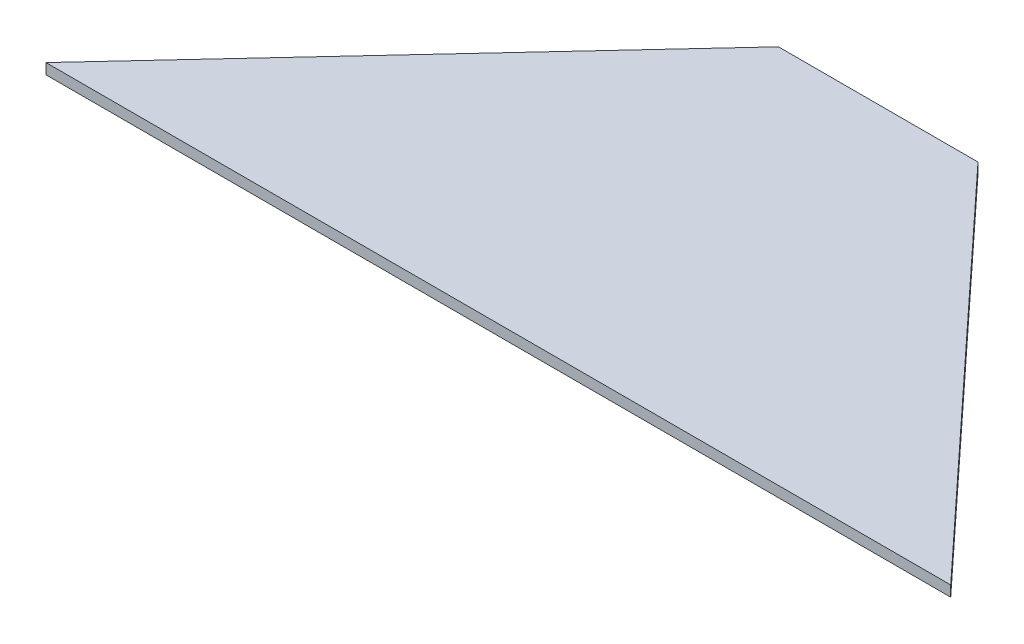
ISO-10303-21;
HEADER;
FILE_DESCRIPTION(('STEP AP214'),'2;1');
FILE_NAME('part.step','',(''),(''),'','','');
FILE_SCHEMA(('AUTOMOTIVE_DESIGN { 1 0 10303 214 1 1 1 1 }'));
ENDSEC;
DATA;
#1=APPLICATION_CONTEXT('core data for automotive mechanical design processes');
#2=APPLICATION_PROTOCOL_DEFINITION('international standard','automotive_design',2000,#1);
#3=PRODUCT_CONTEXT('',#1,'mechanical');
#4=PRODUCT('Part','Part','',(#3));
#5=PRODUCT_RELATED_PRODUCT_CATEGORY('part','',(#4));
#6=PRODUCT_DEFINITION_FORMATION('','',#4);
#7=PRODUCT_DEFINITION_CONTEXT('part definition',#1,'design');
#8=PRODUCT_DEFINITION('design','',#6,#7);
#9=PRODUCT_DEFINITION_SHAPE('','',#8);
#10=(LENGTH_UNIT() NAMED_UNIT(*) SI_UNIT(.MILLI.,.METRE.));
#11=(NAMED_UNIT(*) PLANE_ANGLE_UNIT() SI_UNIT($,.RADIAN.));
#12=(NAMED_UNIT(*) SI_UNIT($,.STERADIAN.) SOLID_ANGLE_UNIT());
#13=UNCERTAINTY_MEASURE_WITH_UNIT(LENGTH_MEASURE(1.E-05),#10,'distance_accuracy_value','');
#14=(GEOMETRIC_REPRESENTATION_CONTEXT(3) GLOBAL_UNCERTAINTY_ASSIGNED_CONTEXT((#13)) GLOBAL_UNIT_ASSIGNED_CONTEXT((#10,
#11,#12)) REPRESENTATION_CONTEXT('',''));
#15=CARTESIAN_POINT('',(0.,0.,0.));
#16=DIRECTION('',(0.,0.,1.));
#17=DIRECTION('',(1.,0.,0.));
#18=AXIS2_PLACEMENT_3D('',#15,#16,#17);
#19=CARTESIAN_POINT('',(0.,14.,0.));
#20=DIRECTION('',(0.,-1.,0.));
#21=DIRECTION('',(0.,0.,-1.));
#22=AXIS2_PLACEMENT_3D('',#19,#20,#21);
#23=PLANE('',#22);
#24=DIRECTION('',(-0.680272612512455,0.,0.73295918894948));
#25=VECTOR('',#24,1.);
#26=CARTESIAN_POINT('',(15.0840298358614,14.,-353.880888193031));
#27=LINE('',#26,#25);
#28=CARTESIAN_POINT('',(15.0840298358614,14.,-353.880888193031));
#29=VERTEX_POINT('',#28);
#30=CARTESIAN_POINT('',(-117.415970164139,14.,-211.118867865441));
#31=VERTEX_POINT('',#30);
#32=EDGE_CURVE('E45',#29,#31,#27,.T.);
#33=ORIENTED_EDGE('',*,*,#32,.T.);
#34=DIRECTION('',(1.,0.,0.));
#35=VECTOR('',#34,1.);
#36=CARTESIAN_POINT('',(-117.415970164139,14.,-211.118867865441));
#37=LINE('',#36,#35);
#38=CARTESIAN_POINT('',(222.584029835861,14.,-211.118867865441));
#39=VERTEX_POINT('',#38);
#40=EDGE_CURVE('E75',#31,#39,#37,.T.);
#41=ORIENTED_EDGE('',*,*,#40,.T.);
#42=DIRECTION('',(-0.680272612512455,0.,-0.73295918894948));
#43=VECTOR('',#42,1.);
#44=CARTESIAN_POINT('',(222.584029835861,14.,-211.118867865441));
#45=LINE('',#44,#43);
#46=CARTESIAN_POINT('',(90.0840298358614,14.,-353.880888193031));
#47=VERTEX_POINT('',#46);
#48=EDGE_CURVE('E71',#39,#47,#45,.T.);
#49=ORIENTED_EDGE('',*,*,#48,.T.);
#50=DIRECTION('',(-1.,0.,0.));
#51=VECTOR('',#50,1.);
#52=CARTESIAN_POINT('',(90.0840298358614,14.,-353.880888193031));
#53=LINE('',#52,#51);
#54=EDGE_CURVE('E66',#47,#29,#53,.T.);
#55=ORIENTED_EDGE('',*,*,#54,.T.);
#56=EDGE_LOOP('',(#33,#41,#49,#55));
#57=FACE_BOUND('',#56,.T.);
#58=ADVANCED_FACE('F36',(#57),#23,.F.);
#59=CARTESIAN_POINT('',(0.,10.,0.));
#60=DIRECTION('',(0.,-1.,0.));
#61=DIRECTION('',(0.,0.,-1.));
#62=AXIS2_PLACEMENT_3D('',#59,#60,#61);
#63=PLANE('',#62);
#64=DIRECTION('',(-0.680272612512455,0.,0.73295918894948));
#65=VECTOR('',#64,1.);
#66=CARTESIAN_POINT('',(15.0840298358614,9.99999999999998,-353.880888193031));
#67=LINE('',#66,#65);
#68=CARTESIAN_POINT('',(15.0840298358614,9.99999999999998,-353.880888193031));
#69=VERTEX_POINT('',#68);
#70=CARTESIAN_POINT('',(-117.415970164139,9.99999999999997,-211.118867865441));
#71=VERTEX_POINT('',#70);
#72=EDGE_CURVE('E12',#69,#71,#67,.T.);
#73=ORIENTED_EDGE('',*,*,#72,.F.);
#74=DIRECTION('',(-1.,0.,0.));
#75=VECTOR('',#74,1.);
#76=CARTESIAN_POINT('',(90.0840298358614,9.99999999999998,-353.880888193031));
#77=LINE('',#76,#75);
#78=CARTESIAN_POINT('',(90.0840298358614,9.99999999999998,-353.880888193031));
#79=VERTEX_POINT('',#78);
#80=EDGE_CURVE('E89',#79,#69,#77,.T.);
#81=ORIENTED_EDGE('',*,*,#80,.F.);
#82=DIRECTION('',(-0.680272612512455,0.,-0.73295918894948));
#83=VECTOR('',#82,1.);
#84=CARTESIAN_POINT('',(222.584029835861,9.99999999999997,-211.118867865441));
#85=LINE('',#84,#83);
#86=CARTESIAN_POINT('',(222.584029835861,9.99999999999997,-211.118867865441));
#87=VERTEX_POINT('',#86);
#88=EDGE_CURVE('E82',#87,#79,#85,.T.);
#89=ORIENTED_EDGE('',*,*,#88,.F.);
#90=DIRECTION('',(1.,0.,0.));
#91=VECTOR('',#90,1.);
#92=CARTESIAN_POINT('',(-117.415970164139,9.99999999999997,-211.118867865441));
#93=LINE('',#92,#91);
#94=EDGE_CURVE('E86',#71,#87,#93,.T.);
#95=ORIENTED_EDGE('',*,*,#94,.F.);
#96=EDGE_LOOP('',(#73,#81,#89,#95));
#97=FACE_BOUND('',#96,.T.);
#98=ADVANCED_FACE('F84',(#97),#63,.T.);
#99=CARTESIAN_POINT('',(90.0840298358614,9.99999999999998,-353.880888193031));
#100=DIRECTION('',(0.,0.,-1.));
#101=DIRECTION('',(-1.,0.,0.));
#102=AXIS2_PLACEMENT_3D('',#99,#100,#101);
#103=PLANE('',#102);
#104=ORIENTED_EDGE('',*,*,#54,.F.);
#105=DIRECTION('',(0.,1.,0.));
#106=VECTOR('',#105,1.);
#107=CARTESIAN_POINT('',(90.0840298358614,9.99999999999998,-353.880888193031));
#108=LINE('',#107,#106);
#109=EDGE_CURVE('E108',#79,#47,#108,.T.);
#110=ORIENTED_EDGE('',*,*,#109,.F.);
#111=ORIENTED_EDGE('',*,*,#80,.T.);
#112=DIRECTION('',(0.,1.,0.));
#113=VECTOR('',#112,1.);
#114=CARTESIAN_POINT('',(15.0840298358614,9.99999999999998,-353.880888193031));
#115=LINE('',#114,#113);
#116=EDGE_CURVE('E121',#69,#29,#115,.T.);
#117=ORIENTED_EDGE('',*,*,#116,.T.);
#118=EDGE_LOOP('',(#104,#110,#111,#117));
#119=FACE_BOUND('',#118,.T.);
#120=ADVANCED_FACE('F132',(#119),#103,.T.);
#121=CARTESIAN_POINT('',(222.584029835861,9.99999999999997,-211.118867865441));
#122=DIRECTION('',(0.73295918894948,0.,-0.680272612512455));
#123=DIRECTION('',(-0.680272612512455,0.,-0.73295918894948));
#124=AXIS2_PLACEMENT_3D('',#121,#122,#123);
#125=PLANE('',#124);
#126=ORIENTED_EDGE('',*,*,#48,.F.);
#127=DIRECTION('',(0.,1.,0.));
#128=VECTOR('',#127,1.);
#129=CARTESIAN_POINT('',(222.584029835861,9.99999999999997,-211.118867865441));
#130=LINE('',#129,#128);
#131=EDGE_CURVE('E92',#87,#39,#130,.T.);
#132=ORIENTED_EDGE('',*,*,#131,.F.);
#133=ORIENTED_EDGE('',*,*,#88,.T.);
#134=ORIENTED_EDGE('',*,*,#109,.T.);
#135=EDGE_LOOP('',(#126,#132,#133,#134));
#136=FACE_BOUND('',#135,.T.);
#137=ADVANCED_FACE('F94',(#136),#125,.T.);
#138=CARTESIAN_POINT('',(-117.415970164139,9.99999999999997,-211.118867865441));
#139=DIRECTION('',(0.,0.,1.));
#140=DIRECTION('',(1.,0.,0.));
#141=AXIS2_PLACEMENT_3D('',#138,#139,#140);
#142=PLANE('',#141);
#143=ORIENTED_EDGE('',*,*,#40,.F.);
#144=DIRECTION('',(0.,1.,0.));
#145=VECTOR('',#144,1.);
#146=CARTESIAN_POINT('',(-117.415970164139,9.99999999999997,-211.118867865441));
#147=LINE('',#146,#145);
#148=EDGE_CURVE('E98',#71,#31,#147,.T.);
#149=ORIENTED_EDGE('',*,*,#148,.F.);
#150=ORIENTED_EDGE('',*,*,#94,.T.);
#151=ORIENTED_EDGE('',*,*,#131,.T.);
#152=EDGE_LOOP('',(#143,#149,#150,#151));
#153=FACE_BOUND('',#152,.T.);
#154=ADVANCED_FACE('F97',(#153),#142,.T.);
#155=CARTESIAN_POINT('',(15.0840298358614,9.99999999999998,-353.880888193031));
#156=DIRECTION('',(-0.73295918894948,0.,-0.680272612512455));
#157=DIRECTION('',(-0.680272612512455,0.,0.73295918894948));
#158=AXIS2_PLACEMENT_3D('',#155,#156,#157);
#159=PLANE('',#158);
#160=ORIENTED_EDGE('',*,*,#32,.F.);
#161=ORIENTED_EDGE('',*,*,#116,.F.);
#162=ORIENTED_EDGE('',*,*,#72,.T.);
#163=ORIENTED_EDGE('',*,*,#148,.T.);
#164=EDGE_LOOP('',(#160,#161,#162,#163));
#165=FACE_BOUND('',#164,.T.);
#166=ADVANCED_FACE('F134',(#165),#159,.T.);
#167=CLOSED_SHELL('',(#58,#98,#120,#137,#154,#166));
#168=MANIFOLD_SOLID_BREP('B2',#167);
#169=ADVANCED_BREP_SHAPE_REPRESENTATION('',(#18,#168),#14);
#170=SHAPE_DEFINITION_REPRESENTATION(#9,#169);
ENDSEC;
END-ISO-10303-21;
